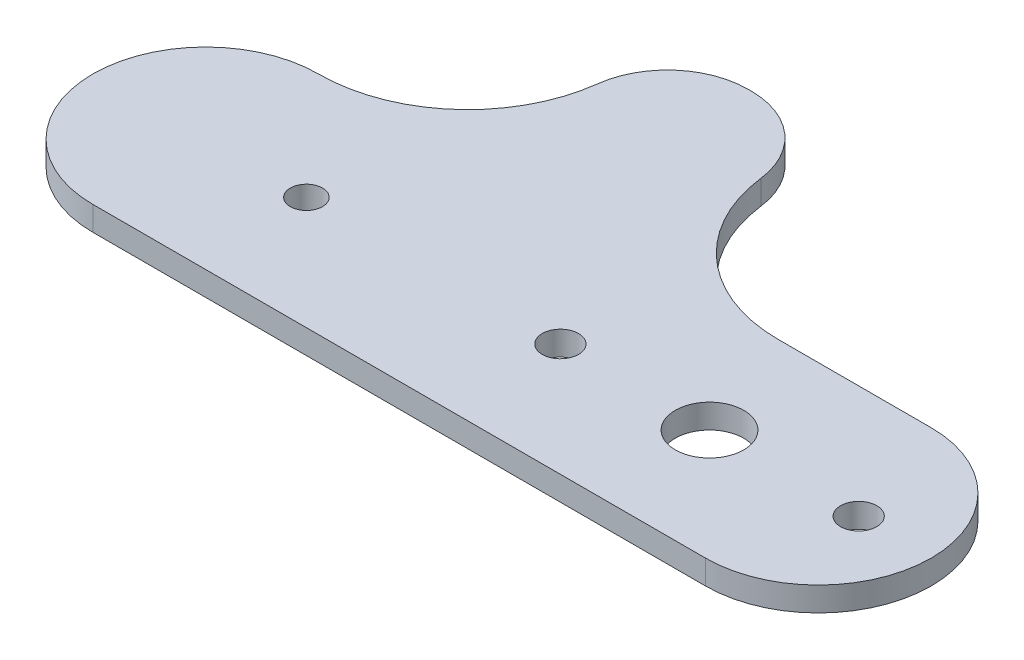
ISO-10303-21;
HEADER;
FILE_DESCRIPTION(('STEP AP214'),'2;1');
FILE_NAME('part.step','',(''),(''),'','','');
FILE_SCHEMA(('AUTOMOTIVE_DESIGN { 1 0 10303 214 1 1 1 1 }'));
ENDSEC;
DATA;
#1=APPLICATION_CONTEXT('core data for automotive mechanical design processes');
#2=APPLICATION_PROTOCOL_DEFINITION('international standard','automotive_design',2000,#1);
#3=PRODUCT_CONTEXT('',#1,'mechanical');
#4=PRODUCT('Part','Part','',(#3));
#5=PRODUCT_RELATED_PRODUCT_CATEGORY('part','',(#4));
#6=PRODUCT_DEFINITION_FORMATION('','',#4);
#7=PRODUCT_DEFINITION_CONTEXT('part definition',#1,'design');
#8=PRODUCT_DEFINITION('design','',#6,#7);
#9=PRODUCT_DEFINITION_SHAPE('','',#8);
#10=(LENGTH_UNIT() NAMED_UNIT(*) SI_UNIT(.MILLI.,.METRE.));
#11=(NAMED_UNIT(*) PLANE_ANGLE_UNIT() SI_UNIT($,.RADIAN.));
#12=(NAMED_UNIT(*) SI_UNIT($,.STERADIAN.) SOLID_ANGLE_UNIT());
#13=UNCERTAINTY_MEASURE_WITH_UNIT(LENGTH_MEASURE(1.E-05),#10,'distance_accuracy_value','');
#14=(GEOMETRIC_REPRESENTATION_CONTEXT(3) GLOBAL_UNCERTAINTY_ASSIGNED_CONTEXT((#13)) GLOBAL_UNIT_ASSIGNED_CONTEXT((#10,
#11,#12)) REPRESENTATION_CONTEXT('',''));
#15=CARTESIAN_POINT('',(0.,0.,0.));
#16=DIRECTION('',(0.,0.,1.));
#17=DIRECTION('',(1.,0.,0.));
#18=AXIS2_PLACEMENT_3D('',#15,#16,#17);
#19=CARTESIAN_POINT('',(31.,0.,0.));
#20=DIRECTION('',(0.,-1.,0.));
#21=DIRECTION('',(0.,0.,-1.));
#22=AXIS2_PLACEMENT_3D('',#19,#20,#21);
#23=CYLINDRICAL_SURFACE('',#22,14.);
#24=DIRECTION('',(0.,-1.,0.));
#25=VECTOR('',#24,1.);
#26=CARTESIAN_POINT('',(31.,3.,14.));
#27=LINE('',#26,#25);
#28=CARTESIAN_POINT('',(30.9999999999999,0.,14.));
#29=VERTEX_POINT('',#28);
#30=CARTESIAN_POINT('',(30.9999999999999,3.,14.));
#31=VERTEX_POINT('',#30);
#32=EDGE_CURVE('E173',#29,#31,#27,.F.);
#33=ORIENTED_EDGE('',*,*,#32,.F.);
#34=CARTESIAN_POINT('',(31.,0.,0.));
#35=DIRECTION('',(0.,1.,0.));
#36=DIRECTION('',(0.,0.,1.));
#37=AXIS2_PLACEMENT_3D('',#34,#35,#36);
#38=CIRCLE('',#37,14.);
#39=CARTESIAN_POINT('',(30.9999999999999,0.,-14.));
#40=VERTEX_POINT('',#39);
#41=EDGE_CURVE('E39',#40,#29,#38,.F.);
#42=ORIENTED_EDGE('',*,*,#41,.F.);
#43=DIRECTION('',(0.,-1.,0.));
#44=VECTOR('',#43,1.);
#45=CARTESIAN_POINT('',(31.,3.,-14.));
#46=LINE('',#45,#44);
#47=CARTESIAN_POINT('',(30.9999999999999,3.,-14.));
#48=VERTEX_POINT('',#47);
#49=EDGE_CURVE('E172',#48,#40,#46,.T.);
#50=ORIENTED_EDGE('',*,*,#49,.F.);
#51=CARTESIAN_POINT('',(31.,3.,0.));
#52=DIRECTION('',(0.,1.,0.));
#53=DIRECTION('',(0.,0.,1.));
#54=AXIS2_PLACEMENT_3D('',#51,#52,#53);
#55=CIRCLE('',#54,14.);
#56=EDGE_CURVE('E11',#31,#48,#55,.T.);
#57=ORIENTED_EDGE('',*,*,#56,.F.);
#58=EDGE_LOOP('',(#33,#42,#50,#57));
#59=FACE_BOUND('',#58,.T.);
#60=ADVANCED_FACE('F32',(#59),#23,.T.);
#61=CARTESIAN_POINT('',(0.,3.,0.));
#62=DIRECTION('',(0.,1.,0.));
#63=DIRECTION('',(0.,0.,1.));
#64=AXIS2_PLACEMENT_3D('',#61,#62,#63);
#65=PLANE('',#64);
#66=CARTESIAN_POINT('',(-1.00000000000002,3.,0.));
#67=DIRECTION('',(0.,1.,0.));
#68=DIRECTION('',(0.,0.,1.));
#69=AXIS2_PLACEMENT_3D('',#66,#67,#68);
#70=CIRCLE('',#69,2.25);
#71=CARTESIAN_POINT('',(-1.00000000000002,3.,2.25));
#72=VERTEX_POINT('',#71);
#73=EDGE_CURVE('E137',#72,#72,#70,.T.);
#74=ORIENTED_EDGE('',*,*,#73,.F.);
#75=EDGE_LOOP('',(#74));
#76=FACE_BOUND('',#75,.T.);
#77=CARTESIAN_POINT('',(36.,3.,0.));
#78=DIRECTION('',(0.,1.,0.));
#79=DIRECTION('',(0.,0.,1.));
#80=AXIS2_PLACEMENT_3D('',#77,#78,#79);
#81=CIRCLE('',#80,2.25);
#82=CARTESIAN_POINT('',(36.,3.,2.25));
#83=VERTEX_POINT('',#82);
#84=EDGE_CURVE('E144',#83,#83,#81,.T.);
#85=ORIENTED_EDGE('',*,*,#84,.F.);
#86=EDGE_LOOP('',(#85));
#87=FACE_BOUND('',#86,.T.);
#88=CARTESIAN_POINT('',(17.5,3.,0.));
#89=DIRECTION('',(0.,1.,0.));
#90=DIRECTION('',(0.,0.,1.));
#91=AXIS2_PLACEMENT_3D('',#88,#89,#90);
#92=CIRCLE('',#91,4.25000000000001);
#93=CARTESIAN_POINT('',(17.5,3.,4.25000000000001));
#94=VERTEX_POINT('',#93);
#95=EDGE_CURVE('E157',#94,#94,#92,.T.);
#96=ORIENTED_EDGE('',*,*,#95,.F.);
#97=EDGE_LOOP('',(#96));
#98=FACE_BOUND('',#97,.T.);
#99=DIRECTION('',(1.,0.,0.));
#100=VECTOR('',#99,1.);
#101=CARTESIAN_POINT('',(-45.,3.,14.));
#102=LINE('',#101,#100);
#103=CARTESIAN_POINT('',(-45.,3.,14.));
#104=VERTEX_POINT('',#103);
#105=EDGE_CURVE('E165',#104,#31,#102,.T.);
#106=ORIENTED_EDGE('',*,*,#105,.T.);
#107=ORIENTED_EDGE('',*,*,#56,.T.);
#108=DIRECTION('',(-1.,0.,0.));
#109=VECTOR('',#108,1.);
#110=CARTESIAN_POINT('',(-45.,3.,-14.));
#111=LINE('',#110,#109);
#112=CARTESIAN_POINT('',(12.,3.,-14.));
#113=VERTEX_POINT('',#112);
#114=EDGE_CURVE('E168',#48,#113,#111,.T.);
#115=ORIENTED_EDGE('',*,*,#114,.T.);
#116=CARTESIAN_POINT('',(12.,3.,-32.5));
#117=DIRECTION('',(0.,1.,0.));
#118=DIRECTION('',(0.,0.,1.));
#119=AXIS2_PLACEMENT_3D('',#116,#117,#118);
#120=CIRCLE('',#119,18.5);
#121=CARTESIAN_POINT('',(-6.35996554659809,3.,-30.2280701754386));
#122=VERTEX_POINT('',#121);
#123=EDGE_CURVE('E184',#113,#122,#120,.F.);
#124=ORIENTED_EDGE('',*,*,#123,.T.);
#125=CARTESIAN_POINT('',(-16.2842712474619,3.,-29.));
#126=DIRECTION('',(0.,1.,0.));
#127=DIRECTION('',(0.,0.,1.));
#128=AXIS2_PLACEMENT_3D('',#125,#126,#127);
#129=CIRCLE('',#128,10.);
#130=CARTESIAN_POINT('',(-16.2842712474619,3.,-39.));
#131=VERTEX_POINT('',#130);
#132=EDGE_CURVE('E194',#122,#131,#129,.T.);
#133=ORIENTED_EDGE('',*,*,#132,.T.);
#134=DIRECTION('',(-1.,0.,0.));
#135=VECTOR('',#134,1.);
#136=CARTESIAN_POINT('',(-26.5,3.,-39.));
#137=LINE('',#136,#135);
#138=CARTESIAN_POINT('',(-16.7157287525381,3.,-39.));
#139=VERTEX_POINT('',#138);
#140=EDGE_CURVE('E129',#131,#139,#137,.T.);
#141=ORIENTED_EDGE('',*,*,#140,.T.);
#142=CARTESIAN_POINT('',(-16.7157287525381,3.,-29.));
#143=DIRECTION('',(0.,1.,0.));
#144=DIRECTION('',(0.,0.,1.));
#145=AXIS2_PLACEMENT_3D('',#142,#143,#144);
#146=CIRCLE('',#145,10.);
#147=CARTESIAN_POINT('',(-26.640034453402,3.,-30.2280701754386));
#148=VERTEX_POINT('',#147);
#149=EDGE_CURVE('E192',#139,#148,#146,.T.);
#150=ORIENTED_EDGE('',*,*,#149,.T.);
#151=CARTESIAN_POINT('',(-45.,3.,-32.5));
#152=DIRECTION('',(0.,1.,0.));
#153=DIRECTION('',(0.,0.,1.));
#154=AXIS2_PLACEMENT_3D('',#151,#152,#153);
#155=CIRCLE('',#154,18.5);
#156=CARTESIAN_POINT('',(-45.,3.,-14.));
#157=VERTEX_POINT('',#156);
#158=EDGE_CURVE('E111',#148,#157,#155,.F.);
#159=ORIENTED_EDGE('',*,*,#158,.T.);
#160=CARTESIAN_POINT('',(-45.,3.,0.));
#161=DIRECTION('',(0.,1.,0.));
#162=DIRECTION('',(0.,0.,1.));
#163=AXIS2_PLACEMENT_3D('',#160,#161,#162);
#164=CIRCLE('',#163,14.);
#165=EDGE_CURVE('E119',#157,#104,#164,.T.);
#166=ORIENTED_EDGE('',*,*,#165,.T.);
#167=EDGE_LOOP('',(#106,#107,#115,#124,#133,#141,#150,#159,#166));
#168=FACE_BOUND('',#167,.T.);
#169=CARTESIAN_POINT('',(-32.5,3.,0.));
#170=DIRECTION('',(0.,1.,0.));
#171=DIRECTION('',(0.,0.,1.));
#172=AXIS2_PLACEMENT_3D('',#169,#170,#171);
#173=CIRCLE('',#172,2.);
#174=CARTESIAN_POINT('',(-32.5,3.,2.));
#175=VERTEX_POINT('',#174);
#176=EDGE_CURVE('E151',#175,#175,#173,.T.);
#177=ORIENTED_EDGE('',*,*,#176,.F.);
#178=EDGE_LOOP('',(#177));
#179=FACE_BOUND('',#178,.T.);
#180=ADVANCED_FACE('F217',(#76,#87,#98,#168,#179),#65,.T.);
#181=CARTESIAN_POINT('',(0.,0.,0.));
#182=DIRECTION('',(0.,1.,0.));
#183=DIRECTION('',(0.,0.,1.));
#184=AXIS2_PLACEMENT_3D('',#181,#182,#183);
#185=PLANE('',#184);
#186=CARTESIAN_POINT('',(-1.00000000000002,0.,0.));
#187=DIRECTION('',(0.,1.,0.));
#188=DIRECTION('',(0.,0.,1.));
#189=AXIS2_PLACEMENT_3D('',#186,#187,#188);
#190=CIRCLE('',#189,2.25);
#191=CARTESIAN_POINT('',(-1.00000000000002,0.,2.25));
#192=VERTEX_POINT('',#191);
#193=EDGE_CURVE('E141',#192,#192,#190,.F.);
#194=ORIENTED_EDGE('',*,*,#193,.F.);
#195=EDGE_LOOP('',(#194));
#196=FACE_BOUND('',#195,.T.);
#197=CARTESIAN_POINT('',(36.,0.,0.));
#198=DIRECTION('',(0.,1.,0.));
#199=DIRECTION('',(0.,0.,1.));
#200=AXIS2_PLACEMENT_3D('',#197,#198,#199);
#201=CIRCLE('',#200,2.25);
#202=CARTESIAN_POINT('',(36.,0.,2.25));
#203=VERTEX_POINT('',#202);
#204=EDGE_CURVE('E147',#203,#203,#201,.F.);
#205=ORIENTED_EDGE('',*,*,#204,.F.);
#206=EDGE_LOOP('',(#205));
#207=FACE_BOUND('',#206,.T.);
#208=CARTESIAN_POINT('',(17.5,0.,0.));
#209=DIRECTION('',(0.,1.,0.));
#210=DIRECTION('',(0.,0.,1.));
#211=AXIS2_PLACEMENT_3D('',#208,#209,#210);
#212=CIRCLE('',#211,4.25000000000001);
#213=CARTESIAN_POINT('',(17.5,0.,4.25000000000001));
#214=VERTEX_POINT('',#213);
#215=EDGE_CURVE('E154',#214,#214,#212,.T.);
#216=ORIENTED_EDGE('',*,*,#215,.T.);
#217=EDGE_LOOP('',(#216));
#218=FACE_BOUND('',#217,.T.);
#219=DIRECTION('',(-1.,0.,0.));
#220=VECTOR('',#219,1.);
#221=CARTESIAN_POINT('',(-45.,0.,-14.));
#222=LINE('',#221,#220);
#223=CARTESIAN_POINT('',(12.,0.,-14.));
#224=VERTEX_POINT('',#223);
#225=EDGE_CURVE('E160',#40,#224,#222,.T.);
#226=ORIENTED_EDGE('',*,*,#225,.F.);
#227=ORIENTED_EDGE('',*,*,#41,.T.);
#228=DIRECTION('',(1.,0.,0.));
#229=VECTOR('',#228,1.);
#230=CARTESIAN_POINT('',(-45.,0.,14.));
#231=LINE('',#230,#229);
#232=CARTESIAN_POINT('',(-45.,0.,14.));
#233=VERTEX_POINT('',#232);
#234=EDGE_CURVE('E128',#233,#29,#231,.T.);
#235=ORIENTED_EDGE('',*,*,#234,.F.);
#236=CARTESIAN_POINT('',(-45.,0.,0.));
#237=DIRECTION('',(0.,1.,0.));
#238=DIRECTION('',(0.,0.,1.));
#239=AXIS2_PLACEMENT_3D('',#236,#237,#238);
#240=CIRCLE('',#239,14.);
#241=CARTESIAN_POINT('',(-45.,0.,-14.));
#242=VERTEX_POINT('',#241);
#243=EDGE_CURVE('E117',#242,#233,#240,.T.);
#244=ORIENTED_EDGE('',*,*,#243,.F.);
#245=CARTESIAN_POINT('',(-45.,0.,-32.5));
#246=DIRECTION('',(0.,1.,0.));
#247=DIRECTION('',(0.,0.,1.));
#248=AXIS2_PLACEMENT_3D('',#245,#246,#247);
#249=CIRCLE('',#248,18.5);
#250=CARTESIAN_POINT('',(-26.640034453402,0.,-30.2280701754386));
#251=VERTEX_POINT('',#250);
#252=EDGE_CURVE('E99',#242,#251,#249,.T.);
#253=ORIENTED_EDGE('',*,*,#252,.T.);
#254=CARTESIAN_POINT('',(-16.7157287525381,0.,-29.));
#255=DIRECTION('',(0.,1.,0.));
#256=DIRECTION('',(0.,0.,1.));
#257=AXIS2_PLACEMENT_3D('',#254,#255,#256);
#258=CIRCLE('',#257,10.);
#259=CARTESIAN_POINT('',(-16.7157287525381,0.,-39.));
#260=VERTEX_POINT('',#259);
#261=EDGE_CURVE('E201',#251,#260,#258,.F.);
#262=ORIENTED_EDGE('',*,*,#261,.T.);
#263=DIRECTION('',(-1.,0.,0.));
#264=VECTOR('',#263,1.);
#265=CARTESIAN_POINT('',(-26.5,0.,-39.));
#266=LINE('',#265,#264);
#267=CARTESIAN_POINT('',(-16.2842712474619,0.,-39.));
#268=VERTEX_POINT('',#267);
#269=EDGE_CURVE('E132',#268,#260,#266,.T.);
#270=ORIENTED_EDGE('',*,*,#269,.F.);
#271=CARTESIAN_POINT('',(-16.2842712474619,0.,-29.));
#272=DIRECTION('',(0.,1.,0.));
#273=DIRECTION('',(0.,0.,1.));
#274=AXIS2_PLACEMENT_3D('',#271,#272,#273);
#275=CIRCLE('',#274,10.);
#276=CARTESIAN_POINT('',(-6.35996554659809,0.,-30.2280701754386));
#277=VERTEX_POINT('',#276);
#278=EDGE_CURVE('E203',#268,#277,#275,.F.);
#279=ORIENTED_EDGE('',*,*,#278,.T.);
#280=CARTESIAN_POINT('',(12.,0.,-32.5));
#281=DIRECTION('',(0.,1.,0.));
#282=DIRECTION('',(0.,0.,1.));
#283=AXIS2_PLACEMENT_3D('',#280,#281,#282);
#284=CIRCLE('',#283,18.5);
#285=EDGE_CURVE('E187',#277,#224,#284,.T.);
#286=ORIENTED_EDGE('',*,*,#285,.T.);
#287=EDGE_LOOP('',(#226,#227,#235,#244,#253,#262,#270,#279,#286));
#288=FACE_BOUND('',#287,.T.);
#289=CARTESIAN_POINT('',(-32.5,0.,0.));
#290=DIRECTION('',(0.,1.,0.));
#291=DIRECTION('',(0.,0.,1.));
#292=AXIS2_PLACEMENT_3D('',#289,#290,#291);
#293=CIRCLE('',#292,2.);
#294=CARTESIAN_POINT('',(-32.5,0.,2.));
#295=VERTEX_POINT('',#294);
#296=EDGE_CURVE('E150',#295,#295,#293,.T.);
#297=ORIENTED_EDGE('',*,*,#296,.T.);
#298=EDGE_LOOP('',(#297));
#299=FACE_BOUND('',#298,.T.);
#300=ADVANCED_FACE('F125',(#196,#207,#218,#288,#299),#185,.F.);
#301=CARTESIAN_POINT('',(-45.,3.,-14.));
#302=DIRECTION('',(0.,0.,1.));
#303=DIRECTION('',(1.,0.,0.));
#304=AXIS2_PLACEMENT_3D('',#301,#302,#303);
#305=PLANE('',#304);
#306=ORIENTED_EDGE('',*,*,#114,.F.);
#307=ORIENTED_EDGE('',*,*,#49,.T.);
#308=ORIENTED_EDGE('',*,*,#225,.T.);
#309=DIRECTION('',(0.,1.,0.));
#310=VECTOR('',#309,1.);
#311=CARTESIAN_POINT('',(12.,3.,-14.));
#312=LINE('',#311,#310);
#313=EDGE_CURVE('E120',#224,#113,#312,.T.);
#314=ORIENTED_EDGE('',*,*,#313,.T.);
#315=EDGE_LOOP('',(#306,#307,#308,#314));
#316=FACE_BOUND('',#315,.T.);
#317=ADVANCED_FACE('F240',(#316),#305,.F.);
#318=CARTESIAN_POINT('',(-45.,3.,14.));
#319=DIRECTION('',(0.,0.,-1.));
#320=DIRECTION('',(-1.,0.,0.));
#321=AXIS2_PLACEMENT_3D('',#318,#319,#320);
#322=PLANE('',#321);
#323=ORIENTED_EDGE('',*,*,#234,.T.);
#324=ORIENTED_EDGE('',*,*,#32,.T.);
#325=ORIENTED_EDGE('',*,*,#105,.F.);
#326=DIRECTION('',(0.,-1.,0.));
#327=VECTOR('',#326,1.);
#328=CARTESIAN_POINT('',(-45.,3.,14.));
#329=LINE('',#328,#327);
#330=EDGE_CURVE('E121',#104,#233,#329,.T.);
#331=ORIENTED_EDGE('',*,*,#330,.T.);
#332=EDGE_LOOP('',(#323,#324,#325,#331));
#333=FACE_BOUND('',#332,.T.);
#334=ADVANCED_FACE('F177',(#333),#322,.F.);
#335=CARTESIAN_POINT('',(17.5,3.,0.));
#336=DIRECTION('',(0.,-1.,0.));
#337=DIRECTION('',(0.,0.,-1.));
#338=AXIS2_PLACEMENT_3D('',#335,#336,#337);
#339=CYLINDRICAL_SURFACE('',#338,4.25000000000001);
#340=ORIENTED_EDGE('',*,*,#95,.T.);
#341=EDGE_LOOP('',(#340));
#342=FACE_BOUND('',#341,.T.);
#343=ORIENTED_EDGE('',*,*,#215,.F.);
#344=EDGE_LOOP('',(#343));
#345=FACE_BOUND('',#344,.T.);
#346=ADVANCED_FACE('F246',(#342,#345),#339,.F.);
#347=CARTESIAN_POINT('',(-32.5,3.,0.));
#348=DIRECTION('',(0.,-1.,0.));
#349=DIRECTION('',(0.,0.,-1.));
#350=AXIS2_PLACEMENT_3D('',#347,#348,#349);
#351=CYLINDRICAL_SURFACE('',#350,2.);
#352=ORIENTED_EDGE('',*,*,#176,.T.);
#353=EDGE_LOOP('',(#352));
#354=FACE_BOUND('',#353,.T.);
#355=ORIENTED_EDGE('',*,*,#296,.F.);
#356=EDGE_LOOP('',(#355));
#357=FACE_BOUND('',#356,.T.);
#358=ADVANCED_FACE('F324',(#354,#357),#351,.F.);
#359=CARTESIAN_POINT('',(36.,-0.00100000000000013,0.));
#360=DIRECTION('',(0.,1.,0.));
#361=DIRECTION('',(0.,0.,1.));
#362=AXIS2_PLACEMENT_3D('',#359,#360,#361);
#363=CYLINDRICAL_SURFACE('',#362,2.25);
#364=CARTESIAN_POINT('',(36.,3.,2.25));
#365=CARTESIAN_POINT('',(36.,2.96875,2.25));
#366=CARTESIAN_POINT('',(36.,2.9375,2.25));
#367=CARTESIAN_POINT('',(36.,2.875,2.25));
#368=CARTESIAN_POINT('',(36.,2.84375,2.25));
#369=CARTESIAN_POINT('',(36.,2.78125,2.25));
#370=CARTESIAN_POINT('',(36.,2.75,2.25));
#371=CARTESIAN_POINT('',(36.,2.6875,2.25));
#372=CARTESIAN_POINT('',(36.,2.65625,2.25));
#373=CARTESIAN_POINT('',(36.,2.59375,2.25));
#374=CARTESIAN_POINT('',(36.,2.5625,2.25));
#375=CARTESIAN_POINT('',(36.,2.5,2.25));
#376=CARTESIAN_POINT('',(36.,2.46875,2.25));
#377=CARTESIAN_POINT('',(36.,2.40625,2.25));
#378=CARTESIAN_POINT('',(36.,2.375,2.25));
#379=CARTESIAN_POINT('',(36.,2.3125,2.25));
#380=CARTESIAN_POINT('',(36.,2.28125,2.25));
#381=CARTESIAN_POINT('',(36.,2.21875,2.25));
#382=CARTESIAN_POINT('',(36.,2.1875,2.25));
#383=CARTESIAN_POINT('',(36.,2.125,2.25));
#384=CARTESIAN_POINT('',(36.,2.09375,2.25));
#385=CARTESIAN_POINT('',(36.,2.03125,2.25));
#386=CARTESIAN_POINT('',(36.,2.,2.25));
#387=CARTESIAN_POINT('',(36.,1.9375,2.25));
#388=CARTESIAN_POINT('',(36.,1.90625,2.25));
#389=CARTESIAN_POINT('',(36.,1.84375,2.25));
#390=CARTESIAN_POINT('',(36.,1.8125,2.25));
#391=CARTESIAN_POINT('',(36.,1.75,2.25));
#392=CARTESIAN_POINT('',(36.,1.71875,2.25));
#393=CARTESIAN_POINT('',(36.,1.65625,2.25));
#394=CARTESIAN_POINT('',(36.,1.625,2.25));
#395=CARTESIAN_POINT('',(36.,1.5625,2.25));
#396=CARTESIAN_POINT('',(36.,1.53125,2.25));
#397=CARTESIAN_POINT('',(36.,1.46875,2.25));
#398=CARTESIAN_POINT('',(36.,1.4375,2.25));
#399=CARTESIAN_POINT('',(36.,1.375,2.25));
#400=CARTESIAN_POINT('',(36.,1.34375,2.25));
#401=CARTESIAN_POINT('',(36.,1.28125,2.25));
#402=CARTESIAN_POINT('',(36.,1.25,2.25));
#403=CARTESIAN_POINT('',(36.,1.1875,2.25));
#404=CARTESIAN_POINT('',(36.,1.15625,2.25));
#405=CARTESIAN_POINT('',(36.,1.09375,2.25));
#406=CARTESIAN_POINT('',(36.,1.0625,2.25));
#407=CARTESIAN_POINT('',(36.,1.,2.25));
#408=CARTESIAN_POINT('',(36.,0.96875,2.25));
#409=CARTESIAN_POINT('',(36.,0.90625,2.25));
#410=CARTESIAN_POINT('',(36.,0.875,2.25));
#411=CARTESIAN_POINT('',(36.,0.8125,2.25));
#412=CARTESIAN_POINT('',(36.,0.78125,2.25));
#413=CARTESIAN_POINT('',(36.,0.71875,2.25));
#414=CARTESIAN_POINT('',(36.,0.6875,2.25));
#415=CARTESIAN_POINT('',(36.,0.625,2.25));
#416=CARTESIAN_POINT('',(36.,0.59375,2.25));
#417=CARTESIAN_POINT('',(36.,0.53125,2.25));
#418=CARTESIAN_POINT('',(36.,0.5,2.25));
#419=CARTESIAN_POINT('',(36.,0.4375,2.25));
#420=CARTESIAN_POINT('',(36.,0.40625,2.25));
#421=CARTESIAN_POINT('',(36.,0.34375,2.25));
#422=CARTESIAN_POINT('',(36.,0.3125,2.25));
#423=CARTESIAN_POINT('',(36.,0.25,2.25));
#424=CARTESIAN_POINT('',(36.,0.21875,2.25));
#425=CARTESIAN_POINT('',(36.,0.15625,2.25));
#426=CARTESIAN_POINT('',(36.,0.125,2.25));
#427=CARTESIAN_POINT('',(36.,0.0625000000000001,2.25));
#428=CARTESIAN_POINT('',(36.,0.0312500000000001,2.25));
#429=CARTESIAN_POINT('',(36.,0.,2.25));
#430=B_SPLINE_CURVE_WITH_KNOTS('',3,(#364,#365,#366,#367,#368,#369,#370,#371,#372,#373,#374,
#375,#376,#377,#378,#379,#380,#381,#382,#383,#384,#385,#386,#387,#388,#389,#390,#391,#392,#393,
#394,#395,#396,#397,#398,#399,#400,#401,#402,#403,#404,#405,#406,#407,#408,#409,#410,#411,#412,
#413,#414,#415,#416,#417,#418,#419,#420,#421,#422,#423,#424,#425,#426,#427,#428,#429),
.UNSPECIFIED.,.F.,.F.,(4,2,2,2,2,2,2,2,2,2,2,2,2,2,2,2,2,2,2,2,2,2,2,2,2,2,2,2,2,2,2,2,4),(0.,
0.0937500000000001,0.1875,0.28125,0.375,0.46875,0.5625,0.65625,0.75,0.84375,0.9375,1.03125,
1.125,1.21875,1.3125,1.40625,1.5,1.59375,1.6875,1.78125,1.875,1.96875,2.0625,2.15625,2.25,
2.34375,2.4375,2.53125,2.625,2.71875,2.8125,2.90625,3.),.UNSPECIFIED.);
#431=EDGE_CURVE('BSEAM330',#83,#203,#430,.T.);
#432=ORIENTED_EDGE('',*,*,#84,.T.);
#433=ORIENTED_EDGE('',*,*,#204,.T.);
#434=ORIENTED_EDGE('',*,*,#431,.T.);
#435=ORIENTED_EDGE('',*,*,#431,.F.);
#436=EDGE_LOOP('',(#432,#434,#433,#435));
#437=FACE_BOUND('',#436,.T.);
#438=ADVANCED_FACE('F330',(#437),#363,.F.);
#439=CARTESIAN_POINT('',(-1.00000000000002,-0.00100000000000013,0.));
#440=DIRECTION('',(0.,1.,0.));
#441=DIRECTION('',(0.,0.,1.));
#442=AXIS2_PLACEMENT_3D('',#439,#440,#441);
#443=CYLINDRICAL_SURFACE('',#442,2.25);
#444=CARTESIAN_POINT('',(-1.00000000000002,3.,2.25));
#445=CARTESIAN_POINT('',(-1.00000000000002,2.96875,2.25));
#446=CARTESIAN_POINT('',(-1.00000000000002,2.9375,2.25));
#447=CARTESIAN_POINT('',(-1.00000000000002,2.875,2.25));
#448=CARTESIAN_POINT('',(-1.00000000000002,2.84375,2.25));
#449=CARTESIAN_POINT('',(-1.00000000000002,2.78125,2.25));
#450=CARTESIAN_POINT('',(-1.00000000000002,2.75,2.25));
#451=CARTESIAN_POINT('',(-1.00000000000002,2.6875,2.25));
#452=CARTESIAN_POINT('',(-1.00000000000002,2.65625,2.25));
#453=CARTESIAN_POINT('',(-1.00000000000002,2.59375,2.25));
#454=CARTESIAN_POINT('',(-1.00000000000002,2.5625,2.25));
#455=CARTESIAN_POINT('',(-1.00000000000002,2.5,2.25));
#456=CARTESIAN_POINT('',(-1.00000000000002,2.46875,2.25));
#457=CARTESIAN_POINT('',(-1.00000000000002,2.40625,2.25));
#458=CARTESIAN_POINT('',(-1.00000000000002,2.375,2.25));
#459=CARTESIAN_POINT('',(-1.00000000000002,2.3125,2.25));
#460=CARTESIAN_POINT('',(-1.00000000000002,2.28125,2.25));
#461=CARTESIAN_POINT('',(-1.00000000000002,2.21875,2.25));
#462=CARTESIAN_POINT('',(-1.00000000000002,2.1875,2.25));
#463=CARTESIAN_POINT('',(-1.00000000000002,2.125,2.25));
#464=CARTESIAN_POINT('',(-1.00000000000002,2.09375,2.25));
#465=CARTESIAN_POINT('',(-1.00000000000002,2.03125,2.25));
#466=CARTESIAN_POINT('',(-1.00000000000002,2.,2.25));
#467=CARTESIAN_POINT('',(-1.00000000000002,1.9375,2.25));
#468=CARTESIAN_POINT('',(-1.00000000000002,1.90625,2.25));
#469=CARTESIAN_POINT('',(-1.00000000000002,1.84375,2.25));
#470=CARTESIAN_POINT('',(-1.00000000000002,1.8125,2.25));
#471=CARTESIAN_POINT('',(-1.00000000000002,1.75,2.25));
#472=CARTESIAN_POINT('',(-1.00000000000002,1.71875,2.25));
#473=CARTESIAN_POINT('',(-1.00000000000002,1.65625,2.25));
#474=CARTESIAN_POINT('',(-1.00000000000002,1.625,2.25));
#475=CARTESIAN_POINT('',(-1.00000000000002,1.5625,2.25));
#476=CARTESIAN_POINT('',(-1.00000000000002,1.53125,2.25));
#477=CARTESIAN_POINT('',(-1.00000000000002,1.46875,2.25));
#478=CARTESIAN_POINT('',(-1.00000000000002,1.4375,2.25));
#479=CARTESIAN_POINT('',(-1.00000000000002,1.375,2.25));
#480=CARTESIAN_POINT('',(-1.00000000000002,1.34375,2.25));
#481=CARTESIAN_POINT('',(-1.00000000000002,1.28125,2.25));
#482=CARTESIAN_POINT('',(-1.00000000000002,1.25,2.25));
#483=CARTESIAN_POINT('',(-1.00000000000002,1.1875,2.25));
#484=CARTESIAN_POINT('',(-1.00000000000002,1.15625,2.25));
#485=CARTESIAN_POINT('',(-1.00000000000002,1.09375,2.25));
#486=CARTESIAN_POINT('',(-1.00000000000002,1.0625,2.25));
#487=CARTESIAN_POINT('',(-1.00000000000002,1.,2.25));
#488=CARTESIAN_POINT('',(-1.00000000000002,0.96875,2.25));
#489=CARTESIAN_POINT('',(-1.00000000000002,0.90625,2.25));
#490=CARTESIAN_POINT('',(-1.00000000000002,0.875,2.25));
#491=CARTESIAN_POINT('',(-1.00000000000002,0.8125,2.25));
#492=CARTESIAN_POINT('',(-1.00000000000002,0.78125,2.25));
#493=CARTESIAN_POINT('',(-1.00000000000002,0.71875,2.25));
#494=CARTESIAN_POINT('',(-1.00000000000002,0.6875,2.25));
#495=CARTESIAN_POINT('',(-1.00000000000002,0.625,2.25));
#496=CARTESIAN_POINT('',(-1.00000000000002,0.59375,2.25));
#497=CARTESIAN_POINT('',(-1.00000000000002,0.53125,2.25));
#498=CARTESIAN_POINT('',(-1.00000000000002,0.5,2.25));
#499=CARTESIAN_POINT('',(-1.00000000000002,0.4375,2.25));
#500=CARTESIAN_POINT('',(-1.00000000000002,0.40625,2.25));
#501=CARTESIAN_POINT('',(-1.00000000000002,0.34375,2.25));
#502=CARTESIAN_POINT('',(-1.00000000000002,0.3125,2.25));
#503=CARTESIAN_POINT('',(-1.00000000000002,0.25,2.25));
#504=CARTESIAN_POINT('',(-1.00000000000002,0.21875,2.25));
#505=CARTESIAN_POINT('',(-1.00000000000002,0.15625,2.25));
#506=CARTESIAN_POINT('',(-1.00000000000002,0.125,2.25));
#507=CARTESIAN_POINT('',(-1.00000000000002,0.0625000000000001,2.25));
#508=CARTESIAN_POINT('',(-1.00000000000002,0.0312500000000001,2.25));
#509=CARTESIAN_POINT('',(-1.00000000000002,0.,2.25));
#510=B_SPLINE_CURVE_WITH_KNOTS('',3,(#444,#445,#446,#447,#448,#449,#450,#451,#452,#453,#454,
#455,#456,#457,#458,#459,#460,#461,#462,#463,#464,#465,#466,#467,#468,#469,#470,#471,#472,#473,
#474,#475,#476,#477,#478,#479,#480,#481,#482,#483,#484,#485,#486,#487,#488,#489,#490,#491,#492,
#493,#494,#495,#496,#497,#498,#499,#500,#501,#502,#503,#504,#505,#506,#507,#508,#509),
.UNSPECIFIED.,.F.,.F.,(4,2,2,2,2,2,2,2,2,2,2,2,2,2,2,2,2,2,2,2,2,2,2,2,2,2,2,2,2,2,2,2,4),(0.,
0.0937500000000001,0.1875,0.28125,0.375,0.46875,0.5625,0.65625,0.75,0.84375,0.9375,1.03125,
1.125,1.21875,1.3125,1.40625,1.5,1.59375,1.6875,1.78125,1.875,1.96875,2.0625,2.15625,2.25,
2.34375,2.4375,2.53125,2.625,2.71875,2.8125,2.90625,3.),.UNSPECIFIED.);
#511=EDGE_CURVE('BSEAM337',#72,#192,#510,.T.);
#512=ORIENTED_EDGE('',*,*,#73,.T.);
#513=ORIENTED_EDGE('',*,*,#193,.T.);
#514=ORIENTED_EDGE('',*,*,#511,.T.);
#515=ORIENTED_EDGE('',*,*,#511,.F.);
#516=EDGE_LOOP('',(#512,#514,#513,#515));
#517=FACE_BOUND('',#516,.T.);
#518=ADVANCED_FACE('F337',(#517),#443,.F.);
#519=CARTESIAN_POINT('',(-26.5,0.,-39.));
#520=DIRECTION('',(0.,0.,-1.));
#521=DIRECTION('',(-1.,0.,0.));
#522=AXIS2_PLACEMENT_3D('',#519,#520,#521);
#523=PLANE('',#522);
#524=ORIENTED_EDGE('',*,*,#140,.F.);
#525=DIRECTION('',(0.,-1.,0.));
#526=VECTOR('',#525,1.);
#527=CARTESIAN_POINT('',(-16.2842712474619,0.,-39.));
#528=LINE('',#527,#526);
#529=EDGE_CURVE('E199',#131,#268,#528,.T.);
#530=ORIENTED_EDGE('',*,*,#529,.T.);
#531=ORIENTED_EDGE('',*,*,#269,.T.);
#532=DIRECTION('',(0.,-1.,0.));
#533=VECTOR('',#532,1.);
#534=CARTESIAN_POINT('',(-16.7157287525381,3.,-39.));
#535=LINE('',#534,#533);
#536=EDGE_CURVE('E196',#260,#139,#535,.F.);
#537=ORIENTED_EDGE('',*,*,#536,.T.);
#538=EDGE_LOOP('',(#524,#530,#531,#537));
#539=FACE_BOUND('',#538,.T.);
#540=ADVANCED_FACE('F220',(#539),#523,.T.);
#541=CARTESIAN_POINT('',(12.,3.,-32.5));
#542=DIRECTION('',(0.,1.,0.));
#543=DIRECTION('',(0.,0.,1.));
#544=AXIS2_PLACEMENT_3D('',#541,#542,#543);
#545=CYLINDRICAL_SURFACE('',#544,18.5);
#546=ORIENTED_EDGE('',*,*,#285,.F.);
#547=DIRECTION('',(0.,1.,0.));
#548=VECTOR('',#547,1.);
#549=CARTESIAN_POINT('',(-6.3599655465981,3.,-30.2280701754386));
#550=LINE('',#549,#548);
#551=EDGE_CURVE('E110',#277,#122,#550,.T.);
#552=ORIENTED_EDGE('',*,*,#551,.T.);
#553=ORIENTED_EDGE('',*,*,#123,.F.);
#554=ORIENTED_EDGE('',*,*,#313,.F.);
#555=EDGE_LOOP('',(#546,#552,#553,#554));
#556=FACE_BOUND('',#555,.T.);
#557=ADVANCED_FACE('F213',(#556),#545,.F.);
#558=CARTESIAN_POINT('',(-45.,0.,-32.5));
#559=DIRECTION('',(0.,1.,0.));
#560=DIRECTION('',(0.,0.,1.));
#561=AXIS2_PLACEMENT_3D('',#558,#559,#560);
#562=CYLINDRICAL_SURFACE('',#561,18.5);
#563=ORIENTED_EDGE('',*,*,#158,.F.);
#564=DIRECTION('',(0.,1.,0.));
#565=VECTOR('',#564,1.);
#566=CARTESIAN_POINT('',(-26.6400344534019,0.,-30.2280701754386));
#567=LINE('',#566,#565);
#568=EDGE_CURVE('E106',#148,#251,#567,.F.);
#569=ORIENTED_EDGE('',*,*,#568,.T.);
#570=ORIENTED_EDGE('',*,*,#252,.F.);
#571=DIRECTION('',(0.,-1.,0.));
#572=VECTOR('',#571,1.);
#573=CARTESIAN_POINT('',(-45.,3.,-14.));
#574=LINE('',#573,#572);
#575=EDGE_CURVE('E103',#157,#242,#574,.T.);
#576=ORIENTED_EDGE('',*,*,#575,.F.);
#577=EDGE_LOOP('',(#563,#569,#570,#576));
#578=FACE_BOUND('',#577,.T.);
#579=ADVANCED_FACE('F102',(#578),#562,.F.);
#580=CARTESIAN_POINT('',(-16.2842712474619,3.,-29.));
#581=DIRECTION('',(0.,1.,0.));
#582=DIRECTION('',(0.,0.,1.));
#583=AXIS2_PLACEMENT_3D('',#580,#581,#582);
#584=CYLINDRICAL_SURFACE('',#583,10.);
#585=ORIENTED_EDGE('',*,*,#278,.F.);
#586=ORIENTED_EDGE('',*,*,#529,.F.);
#587=ORIENTED_EDGE('',*,*,#132,.F.);
#588=ORIENTED_EDGE('',*,*,#551,.F.);
#589=EDGE_LOOP('',(#585,#586,#587,#588));
#590=FACE_BOUND('',#589,.T.);
#591=ADVANCED_FACE('F215',(#590),#584,.T.);
#592=CARTESIAN_POINT('',(-16.7157287525381,0.,-29.));
#593=DIRECTION('',(0.,1.,0.));
#594=DIRECTION('',(0.,0.,1.));
#595=AXIS2_PLACEMENT_3D('',#592,#593,#594);
#596=CYLINDRICAL_SURFACE('',#595,10.);
#597=ORIENTED_EDGE('',*,*,#261,.F.);
#598=ORIENTED_EDGE('',*,*,#568,.F.);
#599=ORIENTED_EDGE('',*,*,#149,.F.);
#600=ORIENTED_EDGE('',*,*,#536,.F.);
#601=EDGE_LOOP('',(#597,#598,#599,#600));
#602=FACE_BOUND('',#601,.T.);
#603=ADVANCED_FACE('F223',(#602),#596,.T.);
#604=CARTESIAN_POINT('',(-45.,0.,0.));
#605=DIRECTION('',(0.,1.,0.));
#606=DIRECTION('',(0.,0.,1.));
#607=AXIS2_PLACEMENT_3D('',#604,#605,#606);
#608=CYLINDRICAL_SURFACE('',#607,14.);
#609=ORIENTED_EDGE('',*,*,#165,.F.);
#610=ORIENTED_EDGE('',*,*,#575,.T.);
#611=ORIENTED_EDGE('',*,*,#243,.T.);
#612=ORIENTED_EDGE('',*,*,#330,.F.);
#613=EDGE_LOOP('',(#609,#610,#611,#612));
#614=FACE_BOUND('',#613,.T.);
#615=ADVANCED_FACE('F115',(#614),#608,.T.);
#616=CLOSED_SHELL('',(#60,#180,#300,#317,#334,#346,#358,#438,#518,#540,#557,#579,#591,#603,#615));
#617=MANIFOLD_SOLID_BREP('B2',#616);
#618=ADVANCED_BREP_SHAPE_REPRESENTATION('',(#18,#617),#14);
#619=SHAPE_DEFINITION_REPRESENTATION(#9,#618);
ENDSEC;
END-ISO-10303-21;
